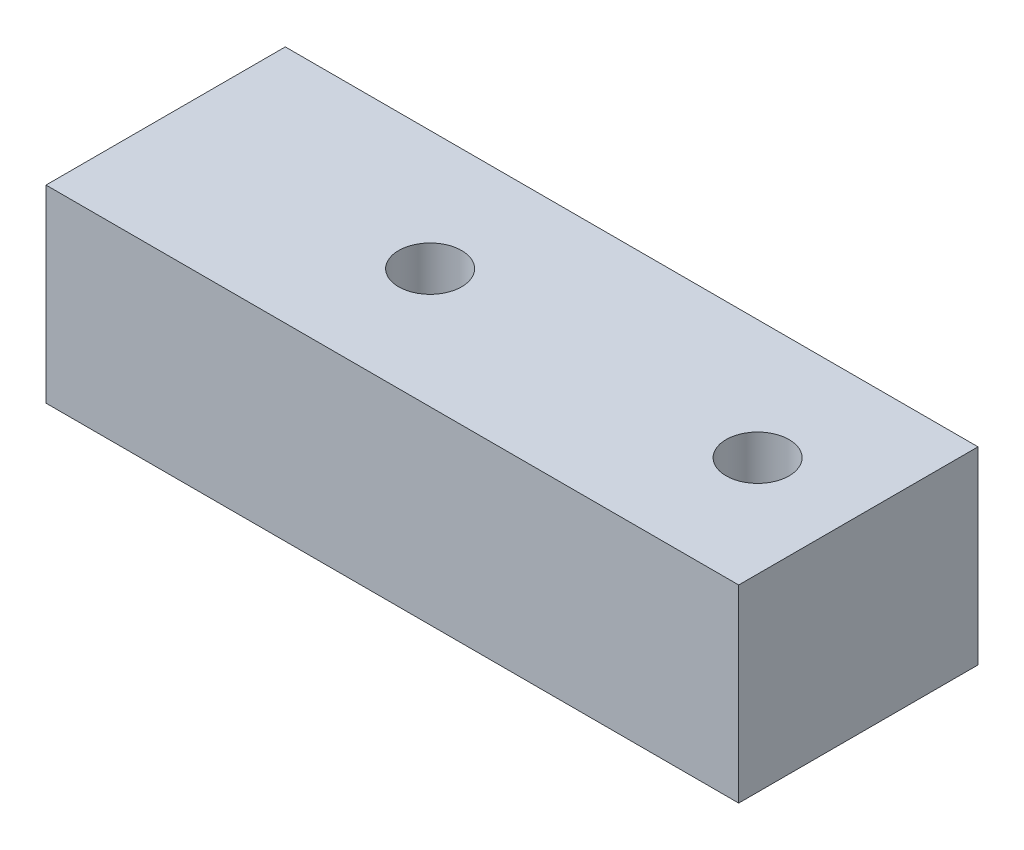
ISO-10303-21;
HEADER;
FILE_DESCRIPTION(('STEP AP214'),'2;1');
FILE_NAME('part.step','',(''),(''),'','','');
FILE_SCHEMA(('AUTOMOTIVE_DESIGN { 1 0 10303 214 1 1 1 1 }'));
ENDSEC;
DATA;
#1=APPLICATION_CONTEXT('core data for automotive mechanical design processes');
#2=APPLICATION_PROTOCOL_DEFINITION('international standard','automotive_design',2000,#1);
#3=PRODUCT_CONTEXT('',#1,'mechanical');
#4=PRODUCT('Part','Part','',(#3));
#5=PRODUCT_RELATED_PRODUCT_CATEGORY('part','',(#4));
#6=PRODUCT_DEFINITION_FORMATION('','',#4);
#7=PRODUCT_DEFINITION_CONTEXT('part definition',#1,'design');
#8=PRODUCT_DEFINITION('design','',#6,#7);
#9=PRODUCT_DEFINITION_SHAPE('','',#8);
#10=(LENGTH_UNIT() NAMED_UNIT(*) SI_UNIT(.MILLI.,.METRE.));
#11=(NAMED_UNIT(*) PLANE_ANGLE_UNIT() SI_UNIT($,.RADIAN.));
#12=(NAMED_UNIT(*) SI_UNIT($,.STERADIAN.) SOLID_ANGLE_UNIT());
#13=UNCERTAINTY_MEASURE_WITH_UNIT(LENGTH_MEASURE(1.E-05),#10,'distance_accuracy_value','');
#14=(GEOMETRIC_REPRESENTATION_CONTEXT(3) GLOBAL_UNCERTAINTY_ASSIGNED_CONTEXT((#13)) GLOBAL_UNIT_ASSIGNED_CONTEXT((#10,
#11,#12)) REPRESENTATION_CONTEXT('',''));
#15=CARTESIAN_POINT('',(0.,0.,0.));
#16=DIRECTION('',(0.,0.,1.));
#17=DIRECTION('',(1.,0.,0.));
#18=AXIS2_PLACEMENT_3D('',#15,#16,#17);
#19=CARTESIAN_POINT('',(-22.8263123279244,15.,-11.9761974798485));
#20=DIRECTION('',(1.,0.,0.));
#21=DIRECTION('',(0.,0.,-1.));
#22=AXIS2_PLACEMENT_3D('',#19,#20,#21);
#23=PLANE('',#22);
#24=DIRECTION('',(0.,0.,1.));
#25=VECTOR('',#24,1.);
#26=CARTESIAN_POINT('',(-22.8263123279244,0.,-11.9761974798485));
#27=LINE('',#26,#25);
#28=CARTESIAN_POINT('',(-22.8263123279244,0.,-11.9761974798485));
#29=VERTEX_POINT('',#28);
#30=CARTESIAN_POINT('',(-22.8263123279244,0.,7.0238025201515));
#31=VERTEX_POINT('',#30);
#32=EDGE_CURVE('E96',#29,#31,#27,.T.);
#33=ORIENTED_EDGE('',*,*,#32,.T.);
#34=DIRECTION('',(0.,-1.,0.));
#35=VECTOR('',#34,1.);
#36=CARTESIAN_POINT('',(-22.8263123279244,15.,7.0238025201515));
#37=LINE('',#36,#35);
#38=CARTESIAN_POINT('',(-22.8263123279244,15.,7.0238025201515));
#39=VERTEX_POINT('',#38);
#40=EDGE_CURVE('E11',#39,#31,#37,.T.);
#41=ORIENTED_EDGE('',*,*,#40,.F.);
#42=DIRECTION('',(0.,0.,1.));
#43=VECTOR('',#42,1.);
#44=CARTESIAN_POINT('',(-22.8263123279244,15.,-11.9761974798485));
#45=LINE('',#44,#43);
#46=CARTESIAN_POINT('',(-22.8263123279244,15.,-11.9761974798485));
#47=VERTEX_POINT('',#46);
#48=EDGE_CURVE('E84',#47,#39,#45,.T.);
#49=ORIENTED_EDGE('',*,*,#48,.F.);
#50=DIRECTION('',(0.,-1.,0.));
#51=VECTOR('',#50,1.);
#52=CARTESIAN_POINT('',(-22.8263123279244,15.,-11.9761974798485));
#53=LINE('',#52,#51);
#54=EDGE_CURVE('E92',#47,#29,#53,.T.);
#55=ORIENTED_EDGE('',*,*,#54,.T.);
#56=EDGE_LOOP('',(#33,#41,#49,#55));
#57=FACE_BOUND('',#56,.T.);
#58=ADVANCED_FACE('F33',(#57),#23,.F.);
#59=CARTESIAN_POINT('',(-22.8263123279244,15.,7.0238025201515));
#60=DIRECTION('',(0.,0.,-1.));
#61=DIRECTION('',(-1.,0.,0.));
#62=AXIS2_PLACEMENT_3D('',#59,#60,#61);
#63=PLANE('',#62);
#64=DIRECTION('',(1.,0.,0.));
#65=VECTOR('',#64,1.);
#66=CARTESIAN_POINT('',(-22.8263123279244,0.,7.0238025201515));
#67=LINE('',#66,#65);
#68=CARTESIAN_POINT('',(32.1736876720756,0.,7.0238025201515));
#69=VERTEX_POINT('',#68);
#70=EDGE_CURVE('E88',#31,#69,#67,.T.);
#71=ORIENTED_EDGE('',*,*,#70,.T.);
#72=DIRECTION('',(0.,-1.,0.));
#73=VECTOR('',#72,1.);
#74=CARTESIAN_POINT('',(32.1736876720756,15.,7.0238025201515));
#75=LINE('',#74,#73);
#76=CARTESIAN_POINT('',(32.1736876720756,15.,7.0238025201515));
#77=VERTEX_POINT('',#76);
#78=EDGE_CURVE('E41',#77,#69,#75,.T.);
#79=ORIENTED_EDGE('',*,*,#78,.F.);
#80=DIRECTION('',(1.,0.,0.));
#81=VECTOR('',#80,1.);
#82=CARTESIAN_POINT('',(-22.8263123279244,15.,7.0238025201515));
#83=LINE('',#82,#81);
#84=EDGE_CURVE('E79',#39,#77,#83,.T.);
#85=ORIENTED_EDGE('',*,*,#84,.F.);
#86=ORIENTED_EDGE('',*,*,#40,.T.);
#87=EDGE_LOOP('',(#71,#79,#85,#86));
#88=FACE_BOUND('',#87,.T.);
#89=ADVANCED_FACE('F87',(#88),#63,.F.);
#90=CARTESIAN_POINT('',(32.1736876720756,15.,-11.9761974798485));
#91=DIRECTION('',(-1.,0.,0.));
#92=DIRECTION('',(0.,0.,1.));
#93=AXIS2_PLACEMENT_3D('',#90,#91,#92);
#94=PLANE('',#93);
#95=DIRECTION('',(0.,0.,-1.));
#96=VECTOR('',#95,1.);
#97=CARTESIAN_POINT('',(32.1736876720756,0.,-11.9761974798485));
#98=LINE('',#97,#96);
#99=CARTESIAN_POINT('',(32.1736876720756,0.,-11.9761974798485));
#100=VERTEX_POINT('',#99);
#101=EDGE_CURVE('E66',#69,#100,#98,.T.);
#102=ORIENTED_EDGE('',*,*,#101,.T.);
#103=DIRECTION('',(0.,-1.,0.));
#104=VECTOR('',#103,1.);
#105=CARTESIAN_POINT('',(32.1736876720756,15.,-11.9761974798485));
#106=LINE('',#105,#104);
#107=CARTESIAN_POINT('',(32.1736876720756,15.,-11.9761974798485));
#108=VERTEX_POINT('',#107);
#109=EDGE_CURVE('E89',#108,#100,#106,.T.);
#110=ORIENTED_EDGE('',*,*,#109,.F.);
#111=DIRECTION('',(0.,0.,-1.));
#112=VECTOR('',#111,1.);
#113=CARTESIAN_POINT('',(32.1736876720756,15.,-11.9761974798485));
#114=LINE('',#113,#112);
#115=EDGE_CURVE('E82',#77,#108,#114,.T.);
#116=ORIENTED_EDGE('',*,*,#115,.F.);
#117=ORIENTED_EDGE('',*,*,#78,.T.);
#118=EDGE_LOOP('',(#102,#110,#116,#117));
#119=FACE_BOUND('',#118,.T.);
#120=ADVANCED_FACE('F90',(#119),#94,.F.);
#121=CARTESIAN_POINT('',(-22.8263123279244,15.,-11.9761974798485));
#122=DIRECTION('',(0.,0.,1.));
#123=DIRECTION('',(1.,0.,0.));
#124=AXIS2_PLACEMENT_3D('',#121,#122,#123);
#125=PLANE('',#124);
#126=DIRECTION('',(-1.,0.,0.));
#127=VECTOR('',#126,1.);
#128=CARTESIAN_POINT('',(-22.8263123279244,0.,-11.9761974798485));
#129=LINE('',#128,#127);
#130=EDGE_CURVE('E72',#100,#29,#129,.T.);
#131=ORIENTED_EDGE('',*,*,#130,.T.);
#132=ORIENTED_EDGE('',*,*,#54,.F.);
#133=DIRECTION('',(-1.,0.,0.));
#134=VECTOR('',#133,1.);
#135=CARTESIAN_POINT('',(-22.8263123279244,15.,-11.9761974798485));
#136=LINE('',#135,#134);
#137=EDGE_CURVE('E49',#108,#47,#136,.T.);
#138=ORIENTED_EDGE('',*,*,#137,.F.);
#139=ORIENTED_EDGE('',*,*,#109,.T.);
#140=EDGE_LOOP('',(#131,#132,#138,#139));
#141=FACE_BOUND('',#140,.T.);
#142=ADVANCED_FACE('F104',(#141),#125,.F.);
#143=CARTESIAN_POINT('',(0.,15.,0.));
#144=DIRECTION('',(0.,1.,0.));
#145=DIRECTION('',(0.,0.,1.));
#146=AXIS2_PLACEMENT_3D('',#143,#144,#145);
#147=PLANE('',#146);
#148=CARTESIAN_POINT('',(-1.82631232792441,15.,-2.47619747984849));
#149=DIRECTION('',(0.,1.,0.));
#150=DIRECTION('',(0.,0.,1.));
#151=AXIS2_PLACEMENT_3D('',#148,#149,#150);
#152=CIRCLE('',#151,2.5);
#153=CARTESIAN_POINT('',(-1.82631232792441,15.,0.0238025201515059));
#154=VERTEX_POINT('',#153);
#155=EDGE_CURVE('E116',#154,#154,#152,.T.);
#156=ORIENTED_EDGE('',*,*,#155,.F.);
#157=EDGE_LOOP('',(#156));
#158=FACE_BOUND('',#157,.T.);
#159=CARTESIAN_POINT('',(24.1736876720756,15.,-2.4761974798485));
#160=DIRECTION('',(0.,1.,0.));
#161=DIRECTION('',(0.,0.,1.));
#162=AXIS2_PLACEMENT_3D('',#159,#160,#161);
#163=CIRCLE('',#162,2.5);
#164=CARTESIAN_POINT('',(24.1736876720756,15.,0.0238025201515033));
#165=VERTEX_POINT('',#164);
#166=EDGE_CURVE('E110',#165,#165,#163,.T.);
#167=ORIENTED_EDGE('',*,*,#166,.F.);
#168=EDGE_LOOP('',(#167));
#169=FACE_BOUND('',#168,.T.);
#170=ORIENTED_EDGE('',*,*,#48,.T.);
#171=ORIENTED_EDGE('',*,*,#84,.T.);
#172=ORIENTED_EDGE('',*,*,#115,.T.);
#173=ORIENTED_EDGE('',*,*,#137,.T.);
#174=EDGE_LOOP('',(#170,#171,#172,#173));
#175=FACE_BOUND('',#174,.T.);
#176=ADVANCED_FACE('F80',(#158,#169,#175),#147,.T.);
#177=CARTESIAN_POINT('',(0.,0.,0.));
#178=DIRECTION('',(0.,1.,0.));
#179=DIRECTION('',(0.,0.,1.));
#180=AXIS2_PLACEMENT_3D('',#177,#178,#179);
#181=PLANE('',#180);
#182=CARTESIAN_POINT('',(-1.82631232792441,0.,-2.47619747984849));
#183=DIRECTION('',(0.,1.,0.));
#184=DIRECTION('',(0.,0.,1.));
#185=AXIS2_PLACEMENT_3D('',#182,#183,#184);
#186=CIRCLE('',#185,2.5);
#187=CARTESIAN_POINT('',(-1.82631232792441,0.,0.0238025201515059));
#188=VERTEX_POINT('',#187);
#189=EDGE_CURVE('E113',#188,#188,#186,.T.);
#190=ORIENTED_EDGE('',*,*,#189,.T.);
#191=EDGE_LOOP('',(#190));
#192=FACE_BOUND('',#191,.T.);
#193=CARTESIAN_POINT('',(24.1736876720756,0.,-2.4761974798485));
#194=DIRECTION('',(0.,1.,0.));
#195=DIRECTION('',(0.,0.,1.));
#196=AXIS2_PLACEMENT_3D('',#193,#194,#195);
#197=CIRCLE('',#196,2.5);
#198=CARTESIAN_POINT('',(24.1736876720756,0.,0.0238025201515033));
#199=VERTEX_POINT('',#198);
#200=EDGE_CURVE('E99',#199,#199,#197,.T.);
#201=ORIENTED_EDGE('',*,*,#200,.T.);
#202=EDGE_LOOP('',(#201));
#203=FACE_BOUND('',#202,.T.);
#204=ORIENTED_EDGE('',*,*,#32,.F.);
#205=ORIENTED_EDGE('',*,*,#130,.F.);
#206=ORIENTED_EDGE('',*,*,#101,.F.);
#207=ORIENTED_EDGE('',*,*,#70,.F.);
#208=EDGE_LOOP('',(#204,#205,#206,#207));
#209=FACE_BOUND('',#208,.T.);
#210=ADVANCED_FACE('F107',(#192,#203,#209),#181,.F.);
#211=CARTESIAN_POINT('',(24.1736876720756,0.,-2.4761974798485));
#212=DIRECTION('',(0.,1.,0.));
#213=DIRECTION('',(0.,0.,1.));
#214=AXIS2_PLACEMENT_3D('',#211,#212,#213);
#215=CYLINDRICAL_SURFACE('',#214,2.5);
#216=ORIENTED_EDGE('',*,*,#200,.F.);
#217=EDGE_LOOP('',(#216));
#218=FACE_BOUND('',#217,.T.);
#219=ORIENTED_EDGE('',*,*,#166,.T.);
#220=EDGE_LOOP('',(#219));
#221=FACE_BOUND('',#220,.T.);
#222=ADVANCED_FACE('F127',(#218,#221),#215,.F.);
#223=CARTESIAN_POINT('',(-1.82631232792441,0.,-2.47619747984849));
#224=DIRECTION('',(0.,1.,0.));
#225=DIRECTION('',(0.,0.,1.));
#226=AXIS2_PLACEMENT_3D('',#223,#224,#225);
#227=CYLINDRICAL_SURFACE('',#226,2.5);
#228=ORIENTED_EDGE('',*,*,#189,.F.);
#229=EDGE_LOOP('',(#228));
#230=FACE_BOUND('',#229,.T.);
#231=ORIENTED_EDGE('',*,*,#155,.T.);
#232=EDGE_LOOP('',(#231));
#233=FACE_BOUND('',#232,.T.);
#234=ADVANCED_FACE('F124',(#230,#233),#227,.F.);
#235=CLOSED_SHELL('',(#58,#89,#120,#142,#176,#210,#222,#234));
#236=MANIFOLD_SOLID_BREP('B2',#235);
#237=ADVANCED_BREP_SHAPE_REPRESENTATION('',(#18,#236),#14);
#238=SHAPE_DEFINITION_REPRESENTATION(#9,#237);
ENDSEC;
END-ISO-10303-21;
